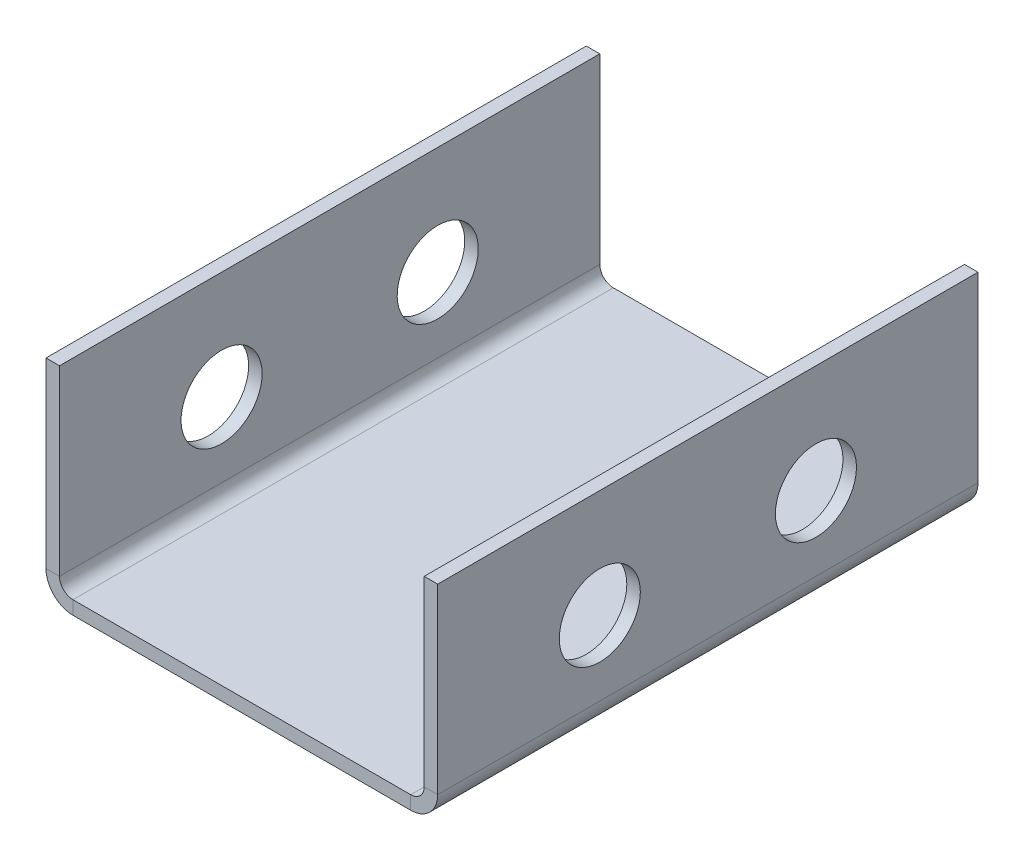
ISO-10303-21;
HEADER;
FILE_DESCRIPTION(('STEP AP214'),'2;1');
FILE_NAME('part.step','',(''),(''),'','','');
FILE_SCHEMA(('AUTOMOTIVE_DESIGN { 1 0 10303 214 1 1 1 1 }'));
ENDSEC;
DATA;
#1=APPLICATION_CONTEXT('core data for automotive mechanical design processes');
#2=APPLICATION_PROTOCOL_DEFINITION('international standard','automotive_design',2000,#1);
#3=PRODUCT_CONTEXT('',#1,'mechanical');
#4=PRODUCT('Part','Part','',(#3));
#5=PRODUCT_RELATED_PRODUCT_CATEGORY('part','',(#4));
#6=PRODUCT_DEFINITION_FORMATION('','',#4);
#7=PRODUCT_DEFINITION_CONTEXT('part definition',#1,'design');
#8=PRODUCT_DEFINITION('design','',#6,#7);
#9=PRODUCT_DEFINITION_SHAPE('','',#8);
#10=(LENGTH_UNIT() NAMED_UNIT(*) SI_UNIT(.MILLI.,.METRE.));
#11=(NAMED_UNIT(*) PLANE_ANGLE_UNIT() SI_UNIT($,.RADIAN.));
#12=(NAMED_UNIT(*) SI_UNIT($,.STERADIAN.) SOLID_ANGLE_UNIT());
#13=UNCERTAINTY_MEASURE_WITH_UNIT(LENGTH_MEASURE(1.E-05),#10,'distance_accuracy_value','');
#14=(GEOMETRIC_REPRESENTATION_CONTEXT(3) GLOBAL_UNCERTAINTY_ASSIGNED_CONTEXT((#13)) GLOBAL_UNIT_ASSIGNED_CONTEXT((#10,
#11,#12)) REPRESENTATION_CONTEXT('',''));
#15=CARTESIAN_POINT('',(0.,0.,0.));
#16=DIRECTION('',(0.,0.,1.));
#17=DIRECTION('',(1.,0.,0.));
#18=AXIS2_PLACEMENT_3D('',#15,#16,#17);
#19=CARTESIAN_POINT('',(-37.7210152284264,-24.7367343485618,20.));
#20=DIRECTION('',(0.,0.,1.));
#21=DIRECTION('',(1.,0.,0.));
#22=AXIS2_PLACEMENT_3D('',#19,#20,#21);
#23=PLANE('',#22);
#24=DIRECTION('',(1.,0.,0.));
#25=VECTOR('',#24,1.);
#26=CARTESIAN_POINT('',(-37.7210152284264,-24.7367343485618,20.));
#27=LINE('',#26,#25);
#28=CARTESIAN_POINT('',(-37.7210152284264,-24.7367343485618,20.));
#29=VERTEX_POINT('',#28);
#30=CARTESIAN_POINT('',(-37.2210152284264,-24.7367343485618,20.));
#31=VERTEX_POINT('',#30);
#32=EDGE_CURVE('E13',#29,#31,#27,.T.);
#33=ORIENTED_EDGE('',*,*,#32,.F.);
#34=CARTESIAN_POINT('',(-36.7210152284264,-24.7367343485618,20.));
#35=DIRECTION('',(0.,0.,-1.));
#36=DIRECTION('',(-1.,0.,0.));
#37=AXIS2_PLACEMENT_3D('',#34,#35,#36);
#38=CIRCLE('',#37,1.);
#39=CARTESIAN_POINT('',(-36.7210152284264,-25.7367343485618,20.));
#40=VERTEX_POINT('',#39);
#41=EDGE_CURVE('E156',#29,#40,#38,.F.);
#42=ORIENTED_EDGE('',*,*,#41,.T.);
#43=DIRECTION('',(0.,-1.,0.));
#44=VECTOR('',#43,1.);
#45=CARTESIAN_POINT('',(-36.7210152284264,-25.2367343485618,20.));
#46=LINE('',#45,#44);
#47=CARTESIAN_POINT('',(-36.7210152284264,-25.2367343485618,20.));
#48=VERTEX_POINT('',#47);
#49=EDGE_CURVE('E54',#48,#40,#46,.T.);
#50=ORIENTED_EDGE('',*,*,#49,.F.);
#51=CARTESIAN_POINT('',(-36.7210152284264,-24.7367343485618,20.));
#52=DIRECTION('',(0.,0.,1.));
#53=DIRECTION('',(1.,0.,0.));
#54=AXIS2_PLACEMENT_3D('',#51,#52,#53);
#55=CIRCLE('',#54,0.5);
#56=EDGE_CURVE('E251',#31,#48,#55,.T.);
#57=ORIENTED_EDGE('',*,*,#56,.F.);
#58=EDGE_LOOP('',(#33,#42,#50,#57));
#59=FACE_BOUND('',#58,.T.);
#60=ADVANCED_FACE('F46',(#59),#23,.T.);
#61=CARTESIAN_POINT('',(-36.7210152284264,-25.2367343485618,20.));
#62=DIRECTION('',(0.,0.,1.));
#63=DIRECTION('',(1.,0.,0.));
#64=AXIS2_PLACEMENT_3D('',#61,#62,#63);
#65=PLANE('',#64);
#66=DIRECTION('',(0.,-1.,0.));
#67=VECTOR('',#66,1.);
#68=CARTESIAN_POINT('',(-37.7210152284264,-17.9867343485618,20.));
#69=LINE('',#68,#67);
#70=CARTESIAN_POINT('',(-37.7210152284264,-17.9867343485618,20.));
#71=VERTEX_POINT('',#70);
#72=EDGE_CURVE('E161',#71,#29,#69,.T.);
#73=ORIENTED_EDGE('',*,*,#72,.T.);
#74=ORIENTED_EDGE('',*,*,#32,.T.);
#75=DIRECTION('',(0.,-1.,0.));
#76=VECTOR('',#75,1.);
#77=CARTESIAN_POINT('',(-37.2210152284264,-17.9867343485618,20.));
#78=LINE('',#77,#76);
#79=CARTESIAN_POINT('',(-37.2210152284264,-17.9867343485618,20.));
#80=VERTEX_POINT('',#79);
#81=EDGE_CURVE('E264',#80,#31,#78,.T.);
#82=ORIENTED_EDGE('',*,*,#81,.F.);
#83=DIRECTION('',(1.,0.,0.));
#84=VECTOR('',#83,1.);
#85=CARTESIAN_POINT('',(-37.7210152284264,-17.9867343485618,20.));
#86=LINE('',#85,#84);
#87=EDGE_CURVE('E266',#71,#80,#86,.T.);
#88=ORIENTED_EDGE('',*,*,#87,.F.);
#89=EDGE_LOOP('',(#73,#74,#82,#88));
#90=FACE_BOUND('',#89,.T.);
#91=ADVANCED_FACE('F277',(#90),#65,.T.);
#92=CARTESIAN_POINT('',(-36.7210152284264,-25.7367343485618,0.));
#93=DIRECTION('',(0.,0.,-1.));
#94=DIRECTION('',(-1.,0.,0.));
#95=AXIS2_PLACEMENT_3D('',#92,#93,#94);
#96=PLANE('',#95);
#97=DIRECTION('',(0.,1.,0.));
#98=VECTOR('',#97,1.);
#99=CARTESIAN_POINT('',(-36.7210152284264,-25.7367343485618,0.));
#100=LINE('',#99,#98);
#101=CARTESIAN_POINT('',(-36.7210152284264,-25.7367343485618,0.));
#102=VERTEX_POINT('',#101);
#103=CARTESIAN_POINT('',(-36.7210152284264,-25.2367343485618,0.));
#104=VERTEX_POINT('',#103);
#105=EDGE_CURVE('E154',#102,#104,#100,.T.);
#106=ORIENTED_EDGE('',*,*,#105,.F.);
#107=CARTESIAN_POINT('',(-36.7210152284264,-24.7367343485618,0.));
#108=DIRECTION('',(0.,0.,-1.));
#109=DIRECTION('',(-1.,0.,0.));
#110=AXIS2_PLACEMENT_3D('',#107,#108,#109);
#111=CIRCLE('',#110,1.);
#112=CARTESIAN_POINT('',(-37.7210152284264,-24.7367343485618,0.));
#113=VERTEX_POINT('',#112);
#114=EDGE_CURVE('E168',#113,#102,#111,.F.);
#115=ORIENTED_EDGE('',*,*,#114,.F.);
#116=DIRECTION('',(-1.,0.,0.));
#117=VECTOR('',#116,1.);
#118=CARTESIAN_POINT('',(-37.2210152284264,-24.7367343485618,0.));
#119=LINE('',#118,#117);
#120=CARTESIAN_POINT('',(-37.2210152284264,-24.7367343485618,0.));
#121=VERTEX_POINT('',#120);
#122=EDGE_CURVE('E242',#121,#113,#119,.T.);
#123=ORIENTED_EDGE('',*,*,#122,.F.);
#124=CARTESIAN_POINT('',(-36.7210152284264,-24.7367343485618,0.));
#125=DIRECTION('',(0.,0.,1.));
#126=DIRECTION('',(1.,0.,0.));
#127=AXIS2_PLACEMENT_3D('',#124,#125,#126);
#128=CIRCLE('',#127,0.5);
#129=EDGE_CURVE('E196',#121,#104,#128,.T.);
#130=ORIENTED_EDGE('',*,*,#129,.T.);
#131=EDGE_LOOP('',(#106,#115,#123,#130));
#132=FACE_BOUND('',#131,.T.);
#133=ADVANCED_FACE('F256',(#132),#96,.T.);
#134=CARTESIAN_POINT('',(-37.2210152284264,-24.7367343485618,0.));
#135=DIRECTION('',(0.,0.,-1.));
#136=DIRECTION('',(-1.,0.,0.));
#137=AXIS2_PLACEMENT_3D('',#134,#135,#136);
#138=PLANE('',#137);
#139=DIRECTION('',(1.,0.,0.));
#140=VECTOR('',#139,1.);
#141=CARTESIAN_POINT('',(-37.7210152284264,-25.7367343485618,0.));
#142=LINE('',#141,#140);
#143=CARTESIAN_POINT('',(-24.2210152284264,-25.7367343485618,0.));
#144=VERTEX_POINT('',#143);
#145=EDGE_CURVE('E209',#102,#144,#142,.T.);
#146=ORIENTED_EDGE('',*,*,#145,.F.);
#147=ORIENTED_EDGE('',*,*,#105,.T.);
#148=DIRECTION('',(1.,0.,0.));
#149=VECTOR('',#148,1.);
#150=CARTESIAN_POINT('',(-37.7210152284264,-25.2367343485618,0.));
#151=LINE('',#150,#149);
#152=CARTESIAN_POINT('',(-24.2210152284264,-25.2367343485618,0.));
#153=VERTEX_POINT('',#152);
#154=EDGE_CURVE('E194',#104,#153,#151,.T.);
#155=ORIENTED_EDGE('',*,*,#154,.T.);
#156=DIRECTION('',(0.,-1.,0.));
#157=VECTOR('',#156,1.);
#158=CARTESIAN_POINT('',(-24.2210152284264,-25.2367343485618,0.));
#159=LINE('',#158,#157);
#160=EDGE_CURVE('E103',#153,#144,#159,.T.);
#161=ORIENTED_EDGE('',*,*,#160,.T.);
#162=EDGE_LOOP('',(#146,#147,#155,#161));
#163=FACE_BOUND('',#162,.T.);
#164=ADVANCED_FACE('F244',(#163),#138,.T.);
#165=CARTESIAN_POINT('',(-24.2210152284264,-25.7367343485618,20.));
#166=DIRECTION('',(0.,0.,1.));
#167=DIRECTION('',(1.,0.,0.));
#168=AXIS2_PLACEMENT_3D('',#165,#166,#167);
#169=PLANE('',#168);
#170=DIRECTION('',(0.,1.,0.));
#171=VECTOR('',#170,1.);
#172=CARTESIAN_POINT('',(-24.2210152284264,-25.7367343485618,20.));
#173=LINE('',#172,#171);
#174=CARTESIAN_POINT('',(-24.2210152284264,-25.7367343485618,20.));
#175=VERTEX_POINT('',#174);
#176=CARTESIAN_POINT('',(-24.2210152284264,-25.2367343485618,20.));
#177=VERTEX_POINT('',#176);
#178=EDGE_CURVE('E240',#175,#177,#173,.T.);
#179=ORIENTED_EDGE('',*,*,#178,.F.);
#180=CARTESIAN_POINT('',(-24.2210152284264,-24.7367343485618,20.));
#181=DIRECTION('',(0.,0.,-1.));
#182=DIRECTION('',(-1.,0.,0.));
#183=AXIS2_PLACEMENT_3D('',#180,#181,#182);
#184=CIRCLE('',#183,1.);
#185=CARTESIAN_POINT('',(-23.2210152284264,-24.7367343485618,20.));
#186=VERTEX_POINT('',#185);
#187=EDGE_CURVE('E176',#175,#186,#184,.F.);
#188=ORIENTED_EDGE('',*,*,#187,.T.);
#189=DIRECTION('',(1.,0.,0.));
#190=VECTOR('',#189,1.);
#191=CARTESIAN_POINT('',(-23.7210152284264,-24.7367343485618,20.));
#192=LINE('',#191,#190);
#193=CARTESIAN_POINT('',(-23.7210152284264,-24.7367343485618,20.));
#194=VERTEX_POINT('',#193);
#195=EDGE_CURVE('E62',#194,#186,#192,.T.);
#196=ORIENTED_EDGE('',*,*,#195,.F.);
#197=CARTESIAN_POINT('',(-24.2210152284264,-24.7367343485618,20.));
#198=DIRECTION('',(0.,0.,1.));
#199=DIRECTION('',(1.,0.,0.));
#200=AXIS2_PLACEMENT_3D('',#197,#198,#199);
#201=CIRCLE('',#200,0.5);
#202=EDGE_CURVE('E268',#177,#194,#201,.T.);
#203=ORIENTED_EDGE('',*,*,#202,.F.);
#204=EDGE_LOOP('',(#179,#188,#196,#203));
#205=FACE_BOUND('',#204,.T.);
#206=ADVANCED_FACE('F305',(#205),#169,.T.);
#207=CARTESIAN_POINT('',(-23.7210152284264,-24.7367343485618,20.));
#208=DIRECTION('',(0.,0.,1.));
#209=DIRECTION('',(1.,0.,0.));
#210=AXIS2_PLACEMENT_3D('',#207,#208,#209);
#211=PLANE('',#210);
#212=DIRECTION('',(1.,0.,0.));
#213=VECTOR('',#212,1.);
#214=CARTESIAN_POINT('',(-37.7210152284264,-25.7367343485618,20.));
#215=LINE('',#214,#213);
#216=EDGE_CURVE('E146',#40,#175,#215,.T.);
#217=ORIENTED_EDGE('',*,*,#216,.T.);
#218=ORIENTED_EDGE('',*,*,#178,.T.);
#219=DIRECTION('',(1.,0.,0.));
#220=VECTOR('',#219,1.);
#221=CARTESIAN_POINT('',(-37.7210152284264,-25.2367343485618,20.));
#222=LINE('',#221,#220);
#223=EDGE_CURVE('E149',#48,#177,#222,.T.);
#224=ORIENTED_EDGE('',*,*,#223,.F.);
#225=ORIENTED_EDGE('',*,*,#49,.T.);
#226=EDGE_LOOP('',(#217,#218,#224,#225));
#227=FACE_BOUND('',#226,.T.);
#228=ADVANCED_FACE('F144',(#227),#211,.T.);
#229=CARTESIAN_POINT('',(-23.2210152284264,-24.7367343485618,0.));
#230=DIRECTION('',(0.,0.,-1.));
#231=DIRECTION('',(-1.,0.,0.));
#232=AXIS2_PLACEMENT_3D('',#229,#230,#231);
#233=PLANE('',#232);
#234=DIRECTION('',(-1.,0.,0.));
#235=VECTOR('',#234,1.);
#236=CARTESIAN_POINT('',(-23.2210152284264,-24.7367343485618,0.));
#237=LINE('',#236,#235);
#238=CARTESIAN_POINT('',(-23.2210152284264,-24.7367343485618,0.));
#239=VERTEX_POINT('',#238);
#240=CARTESIAN_POINT('',(-23.7210152284264,-24.7367343485618,0.));
#241=VERTEX_POINT('',#240);
#242=EDGE_CURVE('E110',#239,#241,#237,.T.);
#243=ORIENTED_EDGE('',*,*,#242,.F.);
#244=CARTESIAN_POINT('',(-24.2210152284264,-24.7367343485618,0.));
#245=DIRECTION('',(0.,0.,-1.));
#246=DIRECTION('',(-1.,0.,0.));
#247=AXIS2_PLACEMENT_3D('',#244,#245,#246);
#248=CIRCLE('',#247,1.);
#249=EDGE_CURVE('E211',#144,#239,#248,.F.);
#250=ORIENTED_EDGE('',*,*,#249,.F.);
#251=ORIENTED_EDGE('',*,*,#160,.F.);
#252=CARTESIAN_POINT('',(-24.2210152284264,-24.7367343485618,0.));
#253=DIRECTION('',(0.,0.,1.));
#254=DIRECTION('',(1.,0.,0.));
#255=AXIS2_PLACEMENT_3D('',#252,#253,#254);
#256=CIRCLE('',#255,0.5);
#257=EDGE_CURVE('E192',#153,#241,#256,.T.);
#258=ORIENTED_EDGE('',*,*,#257,.T.);
#259=EDGE_LOOP('',(#243,#250,#251,#258));
#260=FACE_BOUND('',#259,.T.);
#261=ADVANCED_FACE('F311',(#260),#233,.T.);
#262=CARTESIAN_POINT('',(-24.2210152284264,-25.2367343485618,0.));
#263=DIRECTION('',(0.,0.,-1.));
#264=DIRECTION('',(-1.,0.,0.));
#265=AXIS2_PLACEMENT_3D('',#262,#263,#264);
#266=PLANE('',#265);
#267=DIRECTION('',(0.,1.,0.));
#268=VECTOR('',#267,1.);
#269=CARTESIAN_POINT('',(-23.2210152284264,-25.7367343485618,0.));
#270=LINE('',#269,#268);
#271=CARTESIAN_POINT('',(-23.2210152284264,-17.9867343485618,0.));
#272=VERTEX_POINT('',#271);
#273=EDGE_CURVE('E182',#239,#272,#270,.T.);
#274=ORIENTED_EDGE('',*,*,#273,.F.);
#275=ORIENTED_EDGE('',*,*,#242,.T.);
#276=DIRECTION('',(0.,1.,0.));
#277=VECTOR('',#276,1.);
#278=CARTESIAN_POINT('',(-23.7210152284264,-25.7367343485618,0.));
#279=LINE('',#278,#277);
#280=CARTESIAN_POINT('',(-23.7210152284264,-17.9867343485618,0.));
#281=VERTEX_POINT('',#280);
#282=EDGE_CURVE('E189',#241,#281,#279,.T.);
#283=ORIENTED_EDGE('',*,*,#282,.T.);
#284=DIRECTION('',(1.,0.,0.));
#285=VECTOR('',#284,1.);
#286=CARTESIAN_POINT('',(-23.7210152284264,-17.9867343485618,0.));
#287=LINE('',#286,#285);
#288=EDGE_CURVE('E185',#281,#272,#287,.T.);
#289=ORIENTED_EDGE('',*,*,#288,.T.);
#290=EDGE_LOOP('',(#274,#275,#283,#289));
#291=FACE_BOUND('',#290,.T.);
#292=ADVANCED_FACE('F314',(#291),#266,.T.);
#293=CARTESIAN_POINT('',(-23.2210152284264,-25.7367343485618,20.));
#294=DIRECTION('',(-1.,0.,0.));
#295=DIRECTION('',(0.,0.,1.));
#296=AXIS2_PLACEMENT_3D('',#293,#294,#295);
#297=PLANE('',#296);
#298=CARTESIAN_POINT('',(-23.2210152284264,-21.9867343485618,6.));
#299=DIRECTION('',(1.,0.,0.));
#300=DIRECTION('',(0.,0.,1.));
#301=AXIS2_PLACEMENT_3D('',#298,#299,#300);
#302=CIRCLE('',#301,1.5);
#303=CARTESIAN_POINT('',(-23.2210152284264,-21.9867343485618,7.5));
#304=VERTEX_POINT('',#303);
#305=EDGE_CURVE('E601',#304,#304,#302,.T.);
#306=ORIENTED_EDGE('',*,*,#305,.F.);
#307=EDGE_LOOP('',(#306));
#308=FACE_BOUND('',#307,.T.);
#309=CARTESIAN_POINT('',(-23.2210152284264,-21.9867343485618,14.));
#310=DIRECTION('',(1.,0.,0.));
#311=DIRECTION('',(0.,0.,-1.));
#312=AXIS2_PLACEMENT_3D('',#309,#310,#311);
#313=CIRCLE('',#312,1.5);
#314=CARTESIAN_POINT('',(-23.2210152284264,-21.9867343485618,12.5));
#315=VERTEX_POINT('',#314);
#316=EDGE_CURVE('E589',#315,#315,#313,.T.);
#317=ORIENTED_EDGE('',*,*,#316,.F.);
#318=EDGE_LOOP('',(#317));
#319=FACE_BOUND('',#318,.T.);
#320=ORIENTED_EDGE('',*,*,#273,.T.);
#321=DIRECTION('',(0.,0.,-1.));
#322=VECTOR('',#321,1.);
#323=CARTESIAN_POINT('',(-23.2210152284264,-17.9867343485618,20.));
#324=LINE('',#323,#322);
#325=CARTESIAN_POINT('',(-23.2210152284264,-17.9867343485618,20.));
#326=VERTEX_POINT('',#325);
#327=EDGE_CURVE('E235',#326,#272,#324,.T.);
#328=ORIENTED_EDGE('',*,*,#327,.F.);
#329=DIRECTION('',(0.,1.,0.));
#330=VECTOR('',#329,1.);
#331=CARTESIAN_POINT('',(-23.2210152284264,-25.7367343485618,20.));
#332=LINE('',#331,#330);
#333=EDGE_CURVE('E116',#186,#326,#332,.T.);
#334=ORIENTED_EDGE('',*,*,#333,.F.);
#335=DIRECTION('',(0.,0.,-1.));
#336=VECTOR('',#335,1.);
#337=CARTESIAN_POINT('',(-23.2210152284264,-24.7367343485618,20.));
#338=LINE('',#337,#336);
#339=EDGE_CURVE('E178',#186,#239,#338,.T.);
#340=ORIENTED_EDGE('',*,*,#339,.T.);
#341=EDGE_LOOP('',(#320,#328,#334,#340));
#342=FACE_BOUND('',#341,.T.);
#343=ADVANCED_FACE('F317',(#308,#319,#342),#297,.F.);
#344=CARTESIAN_POINT('',(-23.7210152284264,-17.9867343485618,20.));
#345=DIRECTION('',(0.,1.,0.));
#346=DIRECTION('',(0.,0.,1.));
#347=AXIS2_PLACEMENT_3D('',#344,#345,#346);
#348=PLANE('',#347);
#349=ORIENTED_EDGE('',*,*,#288,.F.);
#350=DIRECTION('',(0.,0.,-1.));
#351=VECTOR('',#350,1.);
#352=CARTESIAN_POINT('',(-23.7210152284264,-17.9867343485618,20.));
#353=LINE('',#352,#351);
#354=CARTESIAN_POINT('',(-23.7210152284264,-17.9867343485618,20.));
#355=VERTEX_POINT('',#354);
#356=EDGE_CURVE('E233',#355,#281,#353,.T.);
#357=ORIENTED_EDGE('',*,*,#356,.F.);
#358=DIRECTION('',(1.,0.,0.));
#359=VECTOR('',#358,1.);
#360=CARTESIAN_POINT('',(-23.7210152284264,-17.9867343485618,20.));
#361=LINE('',#360,#359);
#362=EDGE_CURVE('E572',#355,#326,#361,.T.);
#363=ORIENTED_EDGE('',*,*,#362,.T.);
#364=ORIENTED_EDGE('',*,*,#327,.T.);
#365=EDGE_LOOP('',(#349,#357,#363,#364));
#366=FACE_BOUND('',#365,.T.);
#367=ADVANCED_FACE('F321',(#366),#348,.T.);
#368=CARTESIAN_POINT('',(-23.7210152284264,-25.7367343485618,20.));
#369=DIRECTION('',(-1.,0.,0.));
#370=DIRECTION('',(0.,0.,1.));
#371=AXIS2_PLACEMENT_3D('',#368,#369,#370);
#372=PLANE('',#371);
#373=CARTESIAN_POINT('',(-23.7210152284264,-21.9867343485618,6.));
#374=DIRECTION('',(-1.,0.,0.));
#375=DIRECTION('',(0.,0.,1.));
#376=AXIS2_PLACEMENT_3D('',#373,#374,#375);
#377=CIRCLE('',#376,1.5);
#378=CARTESIAN_POINT('',(-23.7210152284264,-21.9867343485618,7.5));
#379=VERTEX_POINT('',#378);
#380=EDGE_CURVE('E592',#379,#379,#377,.T.);
#381=ORIENTED_EDGE('',*,*,#380,.F.);
#382=EDGE_LOOP('',(#381));
#383=FACE_BOUND('',#382,.T.);
#384=CARTESIAN_POINT('',(-23.7210152284264,-21.9867343485618,14.));
#385=DIRECTION('',(-1.,0.,0.));
#386=DIRECTION('',(0.,0.,1.));
#387=AXIS2_PLACEMENT_3D('',#384,#385,#386);
#388=CIRCLE('',#387,1.5);
#389=CARTESIAN_POINT('',(-23.7210152284264,-21.9867343485618,15.5));
#390=VERTEX_POINT('',#389);
#391=EDGE_CURVE('E186',#390,#390,#388,.T.);
#392=ORIENTED_EDGE('',*,*,#391,.F.);
#393=EDGE_LOOP('',(#392));
#394=FACE_BOUND('',#393,.T.);
#395=ORIENTED_EDGE('',*,*,#282,.F.);
#396=DIRECTION('',(0.,0.,-1.));
#397=VECTOR('',#396,1.);
#398=CARTESIAN_POINT('',(-23.7210152284264,-24.7367343485618,20.));
#399=LINE('',#398,#397);
#400=EDGE_CURVE('E230',#194,#241,#399,.T.);
#401=ORIENTED_EDGE('',*,*,#400,.F.);
#402=DIRECTION('',(0.,1.,0.));
#403=VECTOR('',#402,1.);
#404=CARTESIAN_POINT('',(-23.7210152284264,-25.7367343485618,20.));
#405=LINE('',#404,#403);
#406=EDGE_CURVE('E574',#194,#355,#405,.T.);
#407=ORIENTED_EDGE('',*,*,#406,.T.);
#408=ORIENTED_EDGE('',*,*,#356,.T.);
#409=EDGE_LOOP('',(#395,#401,#407,#408));
#410=FACE_BOUND('',#409,.T.);
#411=ADVANCED_FACE('F325',(#383,#394,#410),#372,.T.);
#412=CARTESIAN_POINT('',(-24.2210152284264,-24.7367343485618,20.));
#413=DIRECTION('',(0.,0.,-1.));
#414=DIRECTION('',(-1.,0.,0.));
#415=AXIS2_PLACEMENT_3D('',#412,#413,#414);
#416=CYLINDRICAL_SURFACE('',#415,0.5);
#417=ORIENTED_EDGE('',*,*,#257,.F.);
#418=DIRECTION('',(0.,0.,-1.));
#419=VECTOR('',#418,1.);
#420=CARTESIAN_POINT('',(-24.2210152284264,-25.2367343485618,20.));
#421=LINE('',#420,#419);
#422=EDGE_CURVE('E227',#177,#153,#421,.T.);
#423=ORIENTED_EDGE('',*,*,#422,.F.);
#424=ORIENTED_EDGE('',*,*,#202,.T.);
#425=ORIENTED_EDGE('',*,*,#400,.T.);
#426=EDGE_LOOP('',(#417,#423,#424,#425));
#427=FACE_BOUND('',#426,.T.);
#428=ADVANCED_FACE('F329',(#427),#416,.F.);
#429=CARTESIAN_POINT('',(-37.7210152284264,-25.2367343485618,20.));
#430=DIRECTION('',(0.,1.,0.));
#431=DIRECTION('',(-1.,0.,0.));
#432=AXIS2_PLACEMENT_3D('',#429,#430,#431);
#433=PLANE('',#432);
#434=ORIENTED_EDGE('',*,*,#154,.F.);
#435=DIRECTION('',(0.,0.,-1.));
#436=VECTOR('',#435,1.);
#437=CARTESIAN_POINT('',(-36.7210152284264,-25.2367343485618,20.));
#438=LINE('',#437,#436);
#439=EDGE_CURVE('E224',#48,#104,#438,.T.);
#440=ORIENTED_EDGE('',*,*,#439,.F.);
#441=ORIENTED_EDGE('',*,*,#223,.T.);
#442=ORIENTED_EDGE('',*,*,#422,.T.);
#443=EDGE_LOOP('',(#434,#440,#441,#442));
#444=FACE_BOUND('',#443,.T.);
#445=ADVANCED_FACE('F253',(#444),#433,.T.);
#446=CARTESIAN_POINT('',(-36.7210152284264,-24.7367343485618,20.));
#447=DIRECTION('',(0.,0.,-1.));
#448=DIRECTION('',(-1.,0.,0.));
#449=AXIS2_PLACEMENT_3D('',#446,#447,#448);
#450=CYLINDRICAL_SURFACE('',#449,0.5);
#451=ORIENTED_EDGE('',*,*,#129,.F.);
#452=DIRECTION('',(0.,0.,-1.));
#453=VECTOR('',#452,1.);
#454=CARTESIAN_POINT('',(-37.2210152284264,-24.7367343485618,20.));
#455=LINE('',#454,#453);
#456=EDGE_CURVE('E221',#31,#121,#455,.T.);
#457=ORIENTED_EDGE('',*,*,#456,.F.);
#458=ORIENTED_EDGE('',*,*,#56,.T.);
#459=ORIENTED_EDGE('',*,*,#439,.T.);
#460=EDGE_LOOP('',(#451,#457,#458,#459));
#461=FACE_BOUND('',#460,.T.);
#462=ADVANCED_FACE('F249',(#461),#450,.F.);
#463=CARTESIAN_POINT('',(-37.2210152284264,-17.9867343485618,20.));
#464=DIRECTION('',(1.,0.,0.));
#465=DIRECTION('',(0.,1.,0.));
#466=AXIS2_PLACEMENT_3D('',#463,#464,#465);
#467=PLANE('',#466);
#468=CARTESIAN_POINT('',(-37.2210152284264,-21.9867343485618,6.));
#469=DIRECTION('',(1.,0.,0.));
#470=DIRECTION('',(0.,1.,0.));
#471=AXIS2_PLACEMENT_3D('',#468,#469,#470);
#472=CIRCLE('',#471,1.5);
#473=CARTESIAN_POINT('',(-37.2210152284264,-20.4867343485618,6.));
#474=VERTEX_POINT('',#473);
#475=EDGE_CURVE('E597',#474,#474,#472,.T.);
#476=ORIENTED_EDGE('',*,*,#475,.F.);
#477=EDGE_LOOP('',(#476));
#478=FACE_BOUND('',#477,.T.);
#479=CARTESIAN_POINT('',(-37.2210152284264,-21.9867343485618,14.));
#480=DIRECTION('',(1.,0.,0.));
#481=DIRECTION('',(0.,1.,0.));
#482=AXIS2_PLACEMENT_3D('',#479,#480,#481);
#483=CIRCLE('',#482,1.5);
#484=CARTESIAN_POINT('',(-37.2210152284264,-20.4867343485618,14.));
#485=VERTEX_POINT('',#484);
#486=EDGE_CURVE('E585',#485,#485,#483,.T.);
#487=ORIENTED_EDGE('',*,*,#486,.F.);
#488=EDGE_LOOP('',(#487));
#489=FACE_BOUND('',#488,.T.);
#490=DIRECTION('',(0.,-1.,0.));
#491=VECTOR('',#490,1.);
#492=CARTESIAN_POINT('',(-37.2210152284264,-17.9867343485618,0.));
#493=LINE('',#492,#491);
#494=CARTESIAN_POINT('',(-37.2210152284264,-17.9867343485618,0.));
#495=VERTEX_POINT('',#494);
#496=EDGE_CURVE('E199',#495,#121,#493,.T.);
#497=ORIENTED_EDGE('',*,*,#496,.F.);
#498=DIRECTION('',(0.,0.,-1.));
#499=VECTOR('',#498,1.);
#500=CARTESIAN_POINT('',(-37.2210152284264,-17.9867343485618,20.));
#501=LINE('',#500,#499);
#502=EDGE_CURVE('E219',#80,#495,#501,.T.);
#503=ORIENTED_EDGE('',*,*,#502,.F.);
#504=ORIENTED_EDGE('',*,*,#81,.T.);
#505=ORIENTED_EDGE('',*,*,#456,.T.);
#506=EDGE_LOOP('',(#497,#503,#504,#505));
#507=FACE_BOUND('',#506,.T.);
#508=ADVANCED_FACE('F262',(#478,#489,#507),#467,.T.);
#509=CARTESIAN_POINT('',(-37.7210152284264,-17.9867343485618,20.));
#510=DIRECTION('',(0.,1.,0.));
#511=DIRECTION('',(0.,0.,1.));
#512=AXIS2_PLACEMENT_3D('',#509,#510,#511);
#513=PLANE('',#512);
#514=DIRECTION('',(1.,0.,0.));
#515=VECTOR('',#514,1.);
#516=CARTESIAN_POINT('',(-37.7210152284264,-17.9867343485618,0.));
#517=LINE('',#516,#515);
#518=CARTESIAN_POINT('',(-37.7210152284264,-17.9867343485618,0.));
#519=VERTEX_POINT('',#518);
#520=EDGE_CURVE('E202',#519,#495,#517,.T.);
#521=ORIENTED_EDGE('',*,*,#520,.F.);
#522=DIRECTION('',(0.,0.,-1.));
#523=VECTOR('',#522,1.);
#524=CARTESIAN_POINT('',(-37.7210152284264,-17.9867343485618,20.));
#525=LINE('',#524,#523);
#526=EDGE_CURVE('E217',#71,#519,#525,.T.);
#527=ORIENTED_EDGE('',*,*,#526,.F.);
#528=ORIENTED_EDGE('',*,*,#87,.T.);
#529=ORIENTED_EDGE('',*,*,#502,.T.);
#530=EDGE_LOOP('',(#521,#527,#528,#529));
#531=FACE_BOUND('',#530,.T.);
#532=ADVANCED_FACE('F283',(#531),#513,.T.);
#533=CARTESIAN_POINT('',(-37.7210152284264,-17.9867343485618,20.));
#534=DIRECTION('',(1.,0.,0.));
#535=DIRECTION('',(0.,1.,0.));
#536=AXIS2_PLACEMENT_3D('',#533,#534,#535);
#537=PLANE('',#536);
#538=CARTESIAN_POINT('',(-37.7210152284264,-21.9867343485618,6.));
#539=DIRECTION('',(1.,0.,0.));
#540=DIRECTION('',(0.,0.,1.));
#541=AXIS2_PLACEMENT_3D('',#538,#539,#540);
#542=CIRCLE('',#541,1.5);
#543=CARTESIAN_POINT('',(-37.7210152284264,-21.9867343485618,7.5));
#544=VERTEX_POINT('',#543);
#545=EDGE_CURVE('E600',#544,#544,#542,.T.);
#546=ORIENTED_EDGE('',*,*,#545,.T.);
#547=EDGE_LOOP('',(#546));
#548=FACE_BOUND('',#547,.T.);
#549=CARTESIAN_POINT('',(-37.7210152284264,-21.9867343485618,14.));
#550=DIRECTION('',(1.,0.,0.));
#551=DIRECTION('',(0.,0.,-1.));
#552=AXIS2_PLACEMENT_3D('',#549,#550,#551);
#553=CIRCLE('',#552,1.5);
#554=CARTESIAN_POINT('',(-37.7210152284264,-21.9867343485618,12.5));
#555=VERTEX_POINT('',#554);
#556=EDGE_CURVE('E588',#555,#555,#553,.T.);
#557=ORIENTED_EDGE('',*,*,#556,.T.);
#558=EDGE_LOOP('',(#557));
#559=FACE_BOUND('',#558,.T.);
#560=DIRECTION('',(0.,-1.,0.));
#561=VECTOR('',#560,1.);
#562=CARTESIAN_POINT('',(-37.7210152284264,-17.9867343485618,0.));
#563=LINE('',#562,#561);
#564=EDGE_CURVE('E205',#519,#113,#563,.T.);
#565=ORIENTED_EDGE('',*,*,#564,.T.);
#566=DIRECTION('',(0.,0.,-1.));
#567=VECTOR('',#566,1.);
#568=CARTESIAN_POINT('',(-37.7210152284264,-24.7367343485618,20.));
#569=LINE('',#568,#567);
#570=EDGE_CURVE('E170',#29,#113,#569,.T.);
#571=ORIENTED_EDGE('',*,*,#570,.F.);
#572=ORIENTED_EDGE('',*,*,#72,.F.);
#573=ORIENTED_EDGE('',*,*,#526,.T.);
#574=EDGE_LOOP('',(#565,#571,#572,#573));
#575=FACE_BOUND('',#574,.T.);
#576=ADVANCED_FACE('F279',(#548,#559,#575),#537,.F.);
#577=CARTESIAN_POINT('',(-36.7210152284264,-24.7367343485618,20.));
#578=DIRECTION('',(0.,0.,-1.));
#579=DIRECTION('',(-1.,0.,0.));
#580=AXIS2_PLACEMENT_3D('',#577,#578,#579);
#581=CYLINDRICAL_SURFACE('',#580,1.);
#582=ORIENTED_EDGE('',*,*,#114,.T.);
#583=DIRECTION('',(0.,0.,-1.));
#584=VECTOR('',#583,1.);
#585=CARTESIAN_POINT('',(-36.7210152284264,-25.7367343485618,20.));
#586=LINE('',#585,#584);
#587=EDGE_CURVE('E165',#40,#102,#586,.T.);
#588=ORIENTED_EDGE('',*,*,#587,.F.);
#589=ORIENTED_EDGE('',*,*,#41,.F.);
#590=ORIENTED_EDGE('',*,*,#570,.T.);
#591=EDGE_LOOP('',(#582,#588,#589,#590));
#592=FACE_BOUND('',#591,.T.);
#593=ADVANCED_FACE('F166',(#592),#581,.T.);
#594=CARTESIAN_POINT('',(-37.7210152284264,-25.7367343485618,20.));
#595=DIRECTION('',(0.,1.,0.));
#596=DIRECTION('',(-1.,0.,0.));
#597=AXIS2_PLACEMENT_3D('',#594,#595,#596);
#598=PLANE('',#597);
#599=ORIENTED_EDGE('',*,*,#145,.T.);
#600=DIRECTION('',(0.,0.,-1.));
#601=VECTOR('',#600,1.);
#602=CARTESIAN_POINT('',(-24.2210152284264,-25.7367343485618,20.));
#603=LINE('',#602,#601);
#604=EDGE_CURVE('E171',#175,#144,#603,.T.);
#605=ORIENTED_EDGE('',*,*,#604,.F.);
#606=ORIENTED_EDGE('',*,*,#216,.F.);
#607=ORIENTED_EDGE('',*,*,#587,.T.);
#608=EDGE_LOOP('',(#599,#605,#606,#607));
#609=FACE_BOUND('',#608,.T.);
#610=ADVANCED_FACE('F173',(#609),#598,.F.);
#611=CARTESIAN_POINT('',(-24.2210152284264,-24.7367343485618,20.));
#612=DIRECTION('',(0.,0.,-1.));
#613=DIRECTION('',(-1.,0.,0.));
#614=AXIS2_PLACEMENT_3D('',#611,#612,#613);
#615=CYLINDRICAL_SURFACE('',#614,1.);
#616=ORIENTED_EDGE('',*,*,#249,.T.);
#617=ORIENTED_EDGE('',*,*,#339,.F.);
#618=ORIENTED_EDGE('',*,*,#187,.F.);
#619=ORIENTED_EDGE('',*,*,#604,.T.);
#620=EDGE_LOOP('',(#616,#617,#618,#619));
#621=FACE_BOUND('',#620,.T.);
#622=ADVANCED_FACE('F458',(#621),#615,.T.);
#623=CARTESIAN_POINT('',(-24.2210152284264,-24.7367343485618,20.));
#624=DIRECTION('',(0.,0.,1.));
#625=DIRECTION('',(1.,0.,0.));
#626=AXIS2_PLACEMENT_3D('',#623,#624,#625);
#627=PLANE('',#626);
#628=ORIENTED_EDGE('',*,*,#333,.T.);
#629=ORIENTED_EDGE('',*,*,#362,.F.);
#630=ORIENTED_EDGE('',*,*,#406,.F.);
#631=ORIENTED_EDGE('',*,*,#195,.T.);
#632=EDGE_LOOP('',(#628,#629,#630,#631));
#633=FACE_BOUND('',#632,.T.);
#634=ADVANCED_FACE('F463',(#633),#627,.T.);
#635=CARTESIAN_POINT('',(-24.2210152284264,-24.7367343485618,0.));
#636=DIRECTION('',(0.,0.,1.));
#637=DIRECTION('',(1.,0.,0.));
#638=AXIS2_PLACEMENT_3D('',#635,#636,#637);
#639=PLANE('',#638);
#640=ORIENTED_EDGE('',*,*,#496,.T.);
#641=ORIENTED_EDGE('',*,*,#122,.T.);
#642=ORIENTED_EDGE('',*,*,#564,.F.);
#643=ORIENTED_EDGE('',*,*,#520,.T.);
#644=EDGE_LOOP('',(#640,#641,#642,#643));
#645=FACE_BOUND('',#644,.T.);
#646=ADVANCED_FACE('F281',(#645),#639,.F.);
#647=CARTESIAN_POINT('',(-37.7210152284264,-21.9867343485618,14.));
#648=DIRECTION('',(1.,0.,0.));
#649=DIRECTION('',(0.,0.,-1.));
#650=AXIS2_PLACEMENT_3D('',#647,#648,#649);
#651=CYLINDRICAL_SURFACE('',#650,1.5);
#652=ORIENTED_EDGE('',*,*,#486,.T.);
#653=EDGE_LOOP('',(#652));
#654=FACE_BOUND('',#653,.T.);
#655=ORIENTED_EDGE('',*,*,#556,.F.);
#656=EDGE_LOOP('',(#655));
#657=FACE_BOUND('',#656,.T.);
#658=ADVANCED_FACE('F365',(#654,#657),#651,.F.);
#659=ORIENTED_EDGE('',*,*,#391,.T.);
#660=EDGE_LOOP('',(#659));
#661=FACE_BOUND('',#660,.T.);
#662=ORIENTED_EDGE('',*,*,#316,.T.);
#663=EDGE_LOOP('',(#662));
#664=FACE_BOUND('',#663,.T.);
#665=ADVANCED_FACE('F370',(#661,#664),#651,.F.);
#666=CARTESIAN_POINT('',(-37.7210152284264,-21.9867343485618,6.));
#667=DIRECTION('',(1.,0.,0.));
#668=DIRECTION('',(0.,0.,-1.));
#669=AXIS2_PLACEMENT_3D('',#666,#667,#668);
#670=CYLINDRICAL_SURFACE('',#669,1.5);
#671=ORIENTED_EDGE('',*,*,#475,.T.);
#672=EDGE_LOOP('',(#671));
#673=FACE_BOUND('',#672,.T.);
#674=ORIENTED_EDGE('',*,*,#545,.F.);
#675=EDGE_LOOP('',(#674));
#676=FACE_BOUND('',#675,.T.);
#677=ADVANCED_FACE('F383',(#673,#676),#670,.F.);
#678=ORIENTED_EDGE('',*,*,#380,.T.);
#679=EDGE_LOOP('',(#678));
#680=FACE_BOUND('',#679,.T.);
#681=ORIENTED_EDGE('',*,*,#305,.T.);
#682=EDGE_LOOP('',(#681));
#683=FACE_BOUND('',#682,.T.);
#684=ADVANCED_FACE('F393',(#680,#683),#670,.F.);
#685=CLOSED_SHELL('',(#60,#91,#133,#164,#206,#228,#261,#292,#343,#367,#411,#428,#445,#462,#508,
#532,#576,#593,#610,#622,#634,#646,#658,#665,#677,#684));
#686=MANIFOLD_SOLID_BREP('B2',#685);
#687=ADVANCED_BREP_SHAPE_REPRESENTATION('',(#18,#686),#14);
#688=SHAPE_DEFINITION_REPRESENTATION(#9,#687);
ENDSEC;
END-ISO-10303-21;
